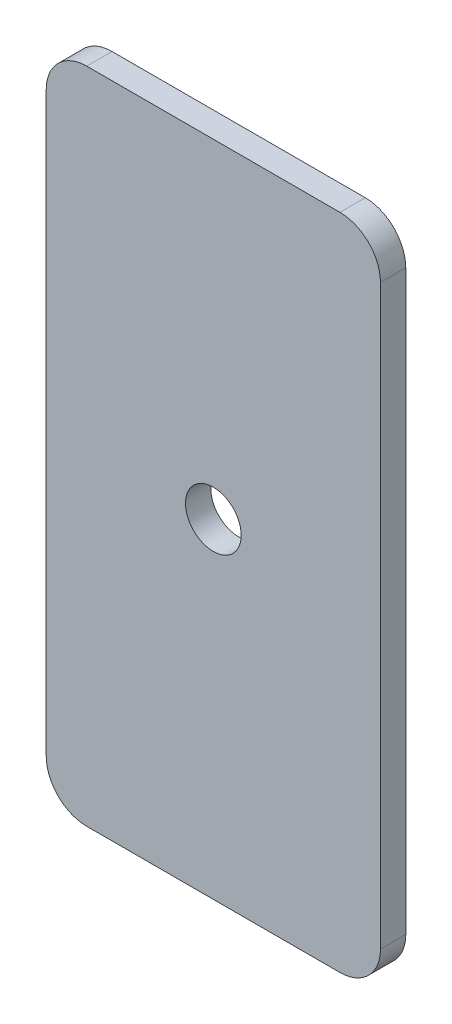
ISO-10303-21;
HEADER;
FILE_DESCRIPTION(('STEP AP214'),'2;1');
FILE_NAME('part.step','',(''),(''),'','','');
FILE_SCHEMA(('AUTOMOTIVE_DESIGN { 1 0 10303 214 1 1 1 1 }'));
ENDSEC;
DATA;
#1=APPLICATION_CONTEXT('core data for automotive mechanical design processes');
#2=APPLICATION_PROTOCOL_DEFINITION('international standard','automotive_design',2000,#1);
#3=PRODUCT_CONTEXT('',#1,'mechanical');
#4=PRODUCT('Part','Part','',(#3));
#5=PRODUCT_RELATED_PRODUCT_CATEGORY('part','',(#4));
#6=PRODUCT_DEFINITION_FORMATION('','',#4);
#7=PRODUCT_DEFINITION_CONTEXT('part definition',#1,'design');
#8=PRODUCT_DEFINITION('design','',#6,#7);
#9=PRODUCT_DEFINITION_SHAPE('','',#8);
#10=(LENGTH_UNIT() NAMED_UNIT(*) SI_UNIT(.MILLI.,.METRE.));
#11=(NAMED_UNIT(*) PLANE_ANGLE_UNIT() SI_UNIT($,.RADIAN.));
#12=(NAMED_UNIT(*) SI_UNIT($,.STERADIAN.) SOLID_ANGLE_UNIT());
#13=UNCERTAINTY_MEASURE_WITH_UNIT(LENGTH_MEASURE(1.E-05),#10,'distance_accuracy_value','');
#14=(GEOMETRIC_REPRESENTATION_CONTEXT(3) GLOBAL_UNCERTAINTY_ASSIGNED_CONTEXT((#13)) GLOBAL_UNIT_ASSIGNED_CONTEXT((#10,
#11,#12)) REPRESENTATION_CONTEXT('',''));
#15=CARTESIAN_POINT('',(0.,0.,0.));
#16=DIRECTION('',(0.,0.,1.));
#17=DIRECTION('',(1.,0.,0.));
#18=AXIS2_PLACEMENT_3D('',#15,#16,#17);
#19=CARTESIAN_POINT('',(-25.,-57.,5.));
#20=DIRECTION('',(0.,0.,-1.));
#21=DIRECTION('',(-1.,0.,0.));
#22=AXIS2_PLACEMENT_3D('',#19,#20,#21);
#23=CYLINDRICAL_SURFACE('',#22,8.);
#24=CARTESIAN_POINT('',(-25.,-57.,0.));
#25=DIRECTION('',(0.,0.,1.));
#26=DIRECTION('',(1.,0.,0.));
#27=AXIS2_PLACEMENT_3D('',#24,#25,#26);
#28=CIRCLE('',#27,8.);
#29=CARTESIAN_POINT('',(-33.,-57.,0.));
#30=VERTEX_POINT('',#29);
#31=CARTESIAN_POINT('',(-25.,-65.,0.));
#32=VERTEX_POINT('',#31);
#33=EDGE_CURVE('E152',#30,#32,#28,.T.);
#34=ORIENTED_EDGE('',*,*,#33,.T.);
#35=DIRECTION('',(0.,0.,-1.));
#36=VECTOR('',#35,1.);
#37=CARTESIAN_POINT('',(-25.,-65.,5.));
#38=LINE('',#37,#36);
#39=CARTESIAN_POINT('',(-25.,-65.,5.));
#40=VERTEX_POINT('',#39);
#41=EDGE_CURVE('E11',#40,#32,#38,.T.);
#42=ORIENTED_EDGE('',*,*,#41,.F.);
#43=CARTESIAN_POINT('',(-25.,-57.,5.));
#44=DIRECTION('',(0.,0.,1.));
#45=DIRECTION('',(1.,0.,0.));
#46=AXIS2_PLACEMENT_3D('',#43,#44,#45);
#47=CIRCLE('',#46,8.);
#48=CARTESIAN_POINT('',(-33.,-57.,5.));
#49=VERTEX_POINT('',#48);
#50=EDGE_CURVE('E175',#49,#40,#47,.T.);
#51=ORIENTED_EDGE('',*,*,#50,.F.);
#52=DIRECTION('',(0.,0.,-1.));
#53=VECTOR('',#52,1.);
#54=CARTESIAN_POINT('',(-33.,-57.,5.));
#55=LINE('',#54,#53);
#56=EDGE_CURVE('E148',#49,#30,#55,.T.);
#57=ORIENTED_EDGE('',*,*,#56,.T.);
#58=EDGE_LOOP('',(#34,#42,#51,#57));
#59=FACE_BOUND('',#58,.T.);
#60=ADVANCED_FACE('F51',(#59),#23,.T.);
#61=CARTESIAN_POINT('',(25.,-65.,5.));
#62=DIRECTION('',(0.,1.,0.));
#63=DIRECTION('',(0.,0.,1.));
#64=AXIS2_PLACEMENT_3D('',#61,#62,#63);
#65=PLANE('',#64);
#66=DIRECTION('',(1.,0.,0.));
#67=VECTOR('',#66,1.);
#68=CARTESIAN_POINT('',(25.,-65.,0.));
#69=LINE('',#68,#67);
#70=CARTESIAN_POINT('',(25.,-65.,0.));
#71=VERTEX_POINT('',#70);
#72=EDGE_CURVE('E156',#32,#71,#69,.T.);
#73=ORIENTED_EDGE('',*,*,#72,.T.);
#74=DIRECTION('',(0.,0.,-1.));
#75=VECTOR('',#74,1.);
#76=CARTESIAN_POINT('',(25.,-65.,5.));
#77=LINE('',#76,#75);
#78=CARTESIAN_POINT('',(25.,-65.,5.));
#79=VERTEX_POINT('',#78);
#80=EDGE_CURVE('E60',#79,#71,#77,.T.);
#81=ORIENTED_EDGE('',*,*,#80,.F.);
#82=DIRECTION('',(1.,0.,0.));
#83=VECTOR('',#82,1.);
#84=CARTESIAN_POINT('',(25.,-65.,5.));
#85=LINE('',#84,#83);
#86=EDGE_CURVE('E111',#40,#79,#85,.T.);
#87=ORIENTED_EDGE('',*,*,#86,.F.);
#88=ORIENTED_EDGE('',*,*,#41,.T.);
#89=EDGE_LOOP('',(#73,#81,#87,#88));
#90=FACE_BOUND('',#89,.T.);
#91=ADVANCED_FACE('F241',(#90),#65,.F.);
#92=CARTESIAN_POINT('',(25.,-57.,5.));
#93=DIRECTION('',(0.,0.,-1.));
#94=DIRECTION('',(-1.,0.,0.));
#95=AXIS2_PLACEMENT_3D('',#92,#93,#94);
#96=CYLINDRICAL_SURFACE('',#95,8.);
#97=CARTESIAN_POINT('',(25.,-57.,0.));
#98=DIRECTION('',(0.,0.,1.));
#99=DIRECTION('',(1.,0.,0.));
#100=AXIS2_PLACEMENT_3D('',#97,#98,#99);
#101=CIRCLE('',#100,8.);
#102=CARTESIAN_POINT('',(33.,-57.,0.));
#103=VERTEX_POINT('',#102);
#104=EDGE_CURVE('E160',#71,#103,#101,.T.);
#105=ORIENTED_EDGE('',*,*,#104,.T.);
#106=DIRECTION('',(0.,0.,-1.));
#107=VECTOR('',#106,1.);
#108=CARTESIAN_POINT('',(33.,-57.,5.));
#109=LINE('',#108,#107);
#110=CARTESIAN_POINT('',(33.,-57.,5.));
#111=VERTEX_POINT('',#110);
#112=EDGE_CURVE('E186',#111,#103,#109,.T.);
#113=ORIENTED_EDGE('',*,*,#112,.F.);
#114=CARTESIAN_POINT('',(25.,-57.,5.));
#115=DIRECTION('',(0.,0.,1.));
#116=DIRECTION('',(1.,0.,0.));
#117=AXIS2_PLACEMENT_3D('',#114,#115,#116);
#118=CIRCLE('',#117,8.);
#119=EDGE_CURVE('E196',#79,#111,#118,.T.);
#120=ORIENTED_EDGE('',*,*,#119,.F.);
#121=ORIENTED_EDGE('',*,*,#80,.T.);
#122=EDGE_LOOP('',(#105,#113,#120,#121));
#123=FACE_BOUND('',#122,.T.);
#124=ADVANCED_FACE('F194',(#123),#96,.T.);
#125=CARTESIAN_POINT('',(33.,57.,5.));
#126=DIRECTION('',(-1.,0.,0.));
#127=DIRECTION('',(0.,-1.,0.));
#128=AXIS2_PLACEMENT_3D('',#125,#126,#127);
#129=PLANE('',#128);
#130=DIRECTION('',(0.,1.,0.));
#131=VECTOR('',#130,1.);
#132=CARTESIAN_POINT('',(33.,57.,0.));
#133=LINE('',#132,#131);
#134=CARTESIAN_POINT('',(33.,57.,0.));
#135=VERTEX_POINT('',#134);
#136=EDGE_CURVE('E163',#103,#135,#133,.T.);
#137=ORIENTED_EDGE('',*,*,#136,.T.);
#138=DIRECTION('',(0.,0.,-1.));
#139=VECTOR('',#138,1.);
#140=CARTESIAN_POINT('',(33.,57.,5.));
#141=LINE('',#140,#139);
#142=CARTESIAN_POINT('',(33.,57.,5.));
#143=VERTEX_POINT('',#142);
#144=EDGE_CURVE('E182',#143,#135,#141,.T.);
#145=ORIENTED_EDGE('',*,*,#144,.F.);
#146=DIRECTION('',(0.,1.,0.));
#147=VECTOR('',#146,1.);
#148=CARTESIAN_POINT('',(33.,57.,5.));
#149=LINE('',#148,#147);
#150=EDGE_CURVE('E209',#111,#143,#149,.T.);
#151=ORIENTED_EDGE('',*,*,#150,.F.);
#152=ORIENTED_EDGE('',*,*,#112,.T.);
#153=EDGE_LOOP('',(#137,#145,#151,#152));
#154=FACE_BOUND('',#153,.T.);
#155=ADVANCED_FACE('F204',(#154),#129,.F.);
#156=CARTESIAN_POINT('',(25.,57.,5.));
#157=DIRECTION('',(0.,0.,-1.));
#158=DIRECTION('',(-1.,0.,0.));
#159=AXIS2_PLACEMENT_3D('',#156,#157,#158);
#160=CYLINDRICAL_SURFACE('',#159,8.);
#161=CARTESIAN_POINT('',(25.,57.,0.));
#162=DIRECTION('',(0.,0.,1.));
#163=DIRECTION('',(1.,0.,0.));
#164=AXIS2_PLACEMENT_3D('',#161,#162,#163);
#165=CIRCLE('',#164,8.);
#166=CARTESIAN_POINT('',(25.,65.,0.));
#167=VERTEX_POINT('',#166);
#168=EDGE_CURVE('E166',#135,#167,#165,.T.);
#169=ORIENTED_EDGE('',*,*,#168,.T.);
#170=DIRECTION('',(0.,0.,-1.));
#171=VECTOR('',#170,1.);
#172=CARTESIAN_POINT('',(25.,65.,5.));
#173=LINE('',#172,#171);
#174=CARTESIAN_POINT('',(25.,65.,5.));
#175=VERTEX_POINT('',#174);
#176=EDGE_CURVE('E141',#175,#167,#173,.T.);
#177=ORIENTED_EDGE('',*,*,#176,.F.);
#178=CARTESIAN_POINT('',(25.,57.,5.));
#179=DIRECTION('',(0.,0.,1.));
#180=DIRECTION('',(1.,0.,0.));
#181=AXIS2_PLACEMENT_3D('',#178,#179,#180);
#182=CIRCLE('',#181,8.);
#183=EDGE_CURVE('E130',#143,#175,#182,.T.);
#184=ORIENTED_EDGE('',*,*,#183,.F.);
#185=ORIENTED_EDGE('',*,*,#144,.T.);
#186=EDGE_LOOP('',(#169,#177,#184,#185));
#187=FACE_BOUND('',#186,.T.);
#188=ADVANCED_FACE('F207',(#187),#160,.T.);
#189=CARTESIAN_POINT('',(25.,65.,5.));
#190=DIRECTION('',(0.,-1.,0.));
#191=DIRECTION('',(0.,0.,-1.));
#192=AXIS2_PLACEMENT_3D('',#189,#190,#191);
#193=PLANE('',#192);
#194=DIRECTION('',(-1.,0.,0.));
#195=VECTOR('',#194,1.);
#196=CARTESIAN_POINT('',(25.,65.,0.));
#197=LINE('',#196,#195);
#198=CARTESIAN_POINT('',(-25.,65.,0.));
#199=VERTEX_POINT('',#198);
#200=EDGE_CURVE('E139',#167,#199,#197,.T.);
#201=ORIENTED_EDGE('',*,*,#200,.T.);
#202=DIRECTION('',(0.,0.,-1.));
#203=VECTOR('',#202,1.);
#204=CARTESIAN_POINT('',(-25.,65.,5.));
#205=LINE('',#204,#203);
#206=CARTESIAN_POINT('',(-25.,65.,5.));
#207=VERTEX_POINT('',#206);
#208=EDGE_CURVE('E136',#207,#199,#205,.T.);
#209=ORIENTED_EDGE('',*,*,#208,.F.);
#210=DIRECTION('',(-1.,0.,0.));
#211=VECTOR('',#210,1.);
#212=CARTESIAN_POINT('',(25.,65.,5.));
#213=LINE('',#212,#211);
#214=EDGE_CURVE('E124',#175,#207,#213,.T.);
#215=ORIENTED_EDGE('',*,*,#214,.F.);
#216=ORIENTED_EDGE('',*,*,#176,.T.);
#217=EDGE_LOOP('',(#201,#209,#215,#216));
#218=FACE_BOUND('',#217,.T.);
#219=ADVANCED_FACE('F137',(#218),#193,.F.);
#220=CARTESIAN_POINT('',(-25.,57.,5.));
#221=DIRECTION('',(0.,0.,-1.));
#222=DIRECTION('',(-1.,0.,0.));
#223=AXIS2_PLACEMENT_3D('',#220,#221,#222);
#224=CYLINDRICAL_SURFACE('',#223,8.);
#225=CARTESIAN_POINT('',(-25.,57.,0.));
#226=DIRECTION('',(0.,0.,1.));
#227=DIRECTION('',(-1.,0.,0.));
#228=AXIS2_PLACEMENT_3D('',#225,#226,#227);
#229=CIRCLE('',#228,8.);
#230=CARTESIAN_POINT('',(-33.,57.,0.));
#231=VERTEX_POINT('',#230);
#232=EDGE_CURVE('E97',#199,#231,#229,.T.);
#233=ORIENTED_EDGE('',*,*,#232,.T.);
#234=DIRECTION('',(0.,0.,-1.));
#235=VECTOR('',#234,1.);
#236=CARTESIAN_POINT('',(-33.,57.,5.));
#237=LINE('',#236,#235);
#238=CARTESIAN_POINT('',(-33.,57.,5.));
#239=VERTEX_POINT('',#238);
#240=EDGE_CURVE('E142',#239,#231,#237,.T.);
#241=ORIENTED_EDGE('',*,*,#240,.F.);
#242=CARTESIAN_POINT('',(-25.,57.,5.));
#243=DIRECTION('',(0.,0.,1.));
#244=DIRECTION('',(-1.,0.,0.));
#245=AXIS2_PLACEMENT_3D('',#242,#243,#244);
#246=CIRCLE('',#245,8.);
#247=EDGE_CURVE('E128',#207,#239,#246,.T.);
#248=ORIENTED_EDGE('',*,*,#247,.F.);
#249=ORIENTED_EDGE('',*,*,#208,.T.);
#250=EDGE_LOOP('',(#233,#241,#248,#249));
#251=FACE_BOUND('',#250,.T.);
#252=ADVANCED_FACE('F144',(#251),#224,.T.);
#253=CARTESIAN_POINT('',(-33.,57.,5.));
#254=DIRECTION('',(1.,0.,0.));
#255=DIRECTION('',(0.,0.,-1.));
#256=AXIS2_PLACEMENT_3D('',#253,#254,#255);
#257=PLANE('',#256);
#258=DIRECTION('',(0.,-1.,0.));
#259=VECTOR('',#258,1.);
#260=CARTESIAN_POINT('',(-33.,57.,0.));
#261=LINE('',#260,#259);
#262=EDGE_CURVE('E103',#231,#30,#261,.T.);
#263=ORIENTED_EDGE('',*,*,#262,.T.);
#264=ORIENTED_EDGE('',*,*,#56,.F.);
#265=DIRECTION('',(0.,-1.,0.));
#266=VECTOR('',#265,1.);
#267=CARTESIAN_POINT('',(-33.,57.,5.));
#268=LINE('',#267,#266);
#269=EDGE_CURVE('E68',#239,#49,#268,.T.);
#270=ORIENTED_EDGE('',*,*,#269,.F.);
#271=ORIENTED_EDGE('',*,*,#240,.T.);
#272=EDGE_LOOP('',(#263,#264,#270,#271));
#273=FACE_BOUND('',#272,.T.);
#274=ADVANCED_FACE('F230',(#273),#257,.F.);
#275=CARTESIAN_POINT('',(-25.,-57.,5.));
#276=DIRECTION('',(0.,0.,1.));
#277=DIRECTION('',(1.,0.,0.));
#278=AXIS2_PLACEMENT_3D('',#275,#276,#277);
#279=PLANE('',#278);
#280=CARTESIAN_POINT('',(0.,0.,5.));
#281=DIRECTION('',(0.,0.,1.));
#282=DIRECTION('',(1.,0.,0.));
#283=AXIS2_PLACEMENT_3D('',#280,#281,#282);
#284=CIRCLE('',#283,5.5);
#285=CARTESIAN_POINT('',(5.5,0.,5.));
#286=VERTEX_POINT('',#285);
#287=EDGE_CURVE('E222',#286,#286,#284,.T.);
#288=ORIENTED_EDGE('',*,*,#287,.F.);
#289=EDGE_LOOP('',(#288));
#290=FACE_BOUND('',#289,.T.);
#291=ORIENTED_EDGE('',*,*,#50,.T.);
#292=ORIENTED_EDGE('',*,*,#86,.T.);
#293=ORIENTED_EDGE('',*,*,#119,.T.);
#294=ORIENTED_EDGE('',*,*,#150,.T.);
#295=ORIENTED_EDGE('',*,*,#183,.T.);
#296=ORIENTED_EDGE('',*,*,#214,.T.);
#297=ORIENTED_EDGE('',*,*,#247,.T.);
#298=ORIENTED_EDGE('',*,*,#269,.T.);
#299=EDGE_LOOP('',(#291,#292,#293,#294,#295,#296,#297,#298));
#300=FACE_BOUND('',#299,.T.);
#301=ADVANCED_FACE('F126',(#290,#300),#279,.T.);
#302=CARTESIAN_POINT('',(-25.,-57.,0.));
#303=DIRECTION('',(0.,0.,1.));
#304=DIRECTION('',(1.,0.,0.));
#305=AXIS2_PLACEMENT_3D('',#302,#303,#304);
#306=PLANE('',#305);
#307=CARTESIAN_POINT('',(0.,0.,0.));
#308=DIRECTION('',(0.,0.,1.));
#309=DIRECTION('',(1.,0.,0.));
#310=AXIS2_PLACEMENT_3D('',#307,#308,#309);
#311=CIRCLE('',#310,5.5);
#312=CARTESIAN_POINT('',(5.5,0.,0.));
#313=VERTEX_POINT('',#312);
#314=EDGE_CURVE('E157',#313,#313,#311,.F.);
#315=ORIENTED_EDGE('',*,*,#314,.F.);
#316=EDGE_LOOP('',(#315));
#317=FACE_BOUND('',#316,.T.);
#318=ORIENTED_EDGE('',*,*,#33,.F.);
#319=ORIENTED_EDGE('',*,*,#262,.F.);
#320=ORIENTED_EDGE('',*,*,#232,.F.);
#321=ORIENTED_EDGE('',*,*,#200,.F.);
#322=ORIENTED_EDGE('',*,*,#168,.F.);
#323=ORIENTED_EDGE('',*,*,#136,.F.);
#324=ORIENTED_EDGE('',*,*,#104,.F.);
#325=ORIENTED_EDGE('',*,*,#72,.F.);
#326=EDGE_LOOP('',(#318,#319,#320,#321,#322,#323,#324,#325));
#327=FACE_BOUND('',#326,.T.);
#328=ADVANCED_FACE('F200',(#317,#327),#306,.F.);
#329=CARTESIAN_POINT('',(0.,0.,-15.556349186104));
#330=DIRECTION('',(0.,0.,1.));
#331=DIRECTION('',(1.,0.,0.));
#332=AXIS2_PLACEMENT_3D('',#329,#330,#331);
#333=CYLINDRICAL_SURFACE('',#332,5.5);
#334=ORIENTED_EDGE('',*,*,#314,.T.);
#335=EDGE_LOOP('',(#334));
#336=FACE_BOUND('',#335,.T.);
#337=ORIENTED_EDGE('',*,*,#287,.T.);
#338=EDGE_LOOP('',(#337));
#339=FACE_BOUND('',#338,.T.);
#340=ADVANCED_FACE('F227',(#336,#339),#333,.F.);
#341=CLOSED_SHELL('',(#60,#91,#124,#155,#188,#219,#252,#274,#301,#328,#340));
#342=MANIFOLD_SOLID_BREP('B2',#341);
#343=ADVANCED_BREP_SHAPE_REPRESENTATION('',(#18,#342),#14);
#344=SHAPE_DEFINITION_REPRESENTATION(#9,#343);
ENDSEC;
END-ISO-10303-21;
